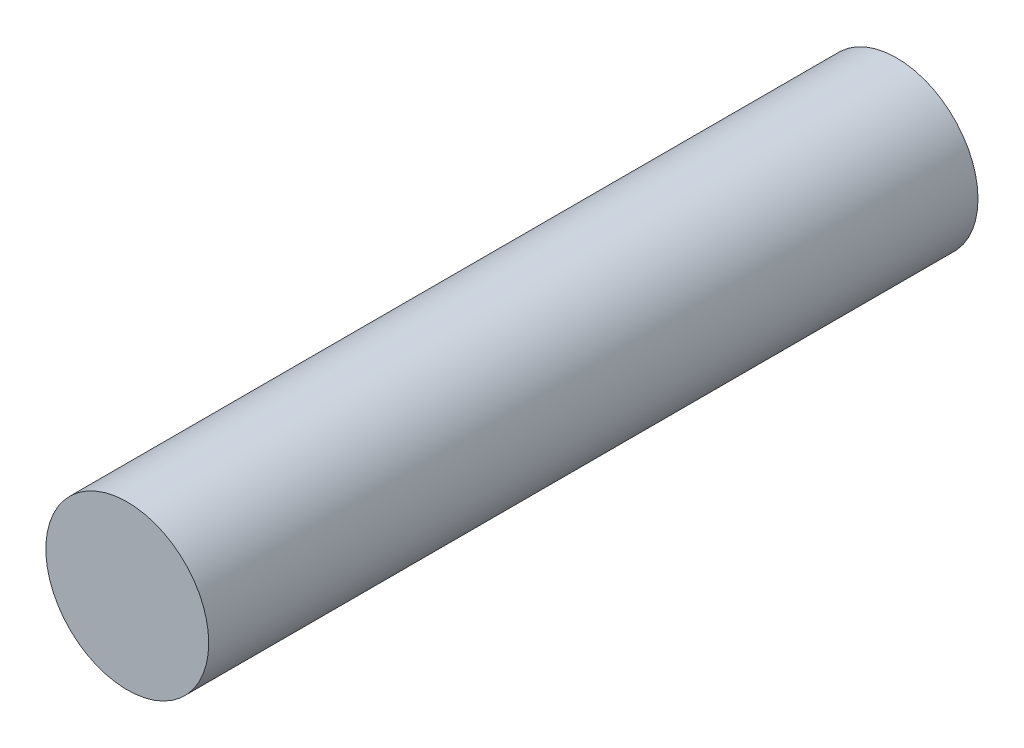
ISO-10303-21;
HEADER;
FILE_DESCRIPTION(('STEP AP214'),'2;1');
FILE_NAME('part.step','',(''),(''),'','','');
FILE_SCHEMA(('AUTOMOTIVE_DESIGN { 1 0 10303 214 1 1 1 1 }'));
ENDSEC;
DATA;
#1=APPLICATION_CONTEXT('core data for automotive mechanical design processes');
#2=APPLICATION_PROTOCOL_DEFINITION('international standard','automotive_design',2000,#1);
#3=PRODUCT_CONTEXT('',#1,'mechanical');
#4=PRODUCT('Part','Part','',(#3));
#5=PRODUCT_RELATED_PRODUCT_CATEGORY('part','',(#4));
#6=PRODUCT_DEFINITION_FORMATION('','',#4);
#7=PRODUCT_DEFINITION_CONTEXT('part definition',#1,'design');
#8=PRODUCT_DEFINITION('design','',#6,#7);
#9=PRODUCT_DEFINITION_SHAPE('','',#8);
#10=(LENGTH_UNIT() NAMED_UNIT(*) SI_UNIT(.MILLI.,.METRE.));
#11=(NAMED_UNIT(*) PLANE_ANGLE_UNIT() SI_UNIT($,.RADIAN.));
#12=(NAMED_UNIT(*) SI_UNIT($,.STERADIAN.) SOLID_ANGLE_UNIT());
#13=UNCERTAINTY_MEASURE_WITH_UNIT(LENGTH_MEASURE(1.E-05),#10,'distance_accuracy_value','');
#14=(GEOMETRIC_REPRESENTATION_CONTEXT(3) GLOBAL_UNCERTAINTY_ASSIGNED_CONTEXT((#13)) GLOBAL_UNIT_ASSIGNED_CONTEXT((#10,
#11,#12)) REPRESENTATION_CONTEXT('',''));
#15=CARTESIAN_POINT('',(0.,0.,0.));
#16=DIRECTION('',(0.,0.,1.));
#17=DIRECTION('',(1.,0.,0.));
#18=AXIS2_PLACEMENT_3D('',#15,#16,#17);
#19=CARTESIAN_POINT('',(0.,0.,37.5));
#20=DIRECTION('',(0.,0.,-1.));
#21=DIRECTION('',(-1.,0.,0.));
#22=AXIS2_PLACEMENT_3D('',#19,#20,#21);
#23=CYLINDRICAL_SURFACE('',#22,7.94);
#24=CARTESIAN_POINT('',(0.,0.,37.5));
#25=DIRECTION('',(0.,0.,1.));
#26=DIRECTION('',(1.,0.,0.));
#27=AXIS2_PLACEMENT_3D('',#24,#25,#26);
#28=CIRCLE('',#27,7.94);
#29=CARTESIAN_POINT('',(7.94,0.,37.5));
#30=VERTEX_POINT('',#29);
#31=EDGE_CURVE('E10',#30,#30,#28,.T.);
#32=ORIENTED_EDGE('',*,*,#31,.F.);
#33=EDGE_LOOP('',(#32));
#34=FACE_BOUND('',#33,.T.);
#35=CARTESIAN_POINT('',(0.,0.,-37.5));
#36=DIRECTION('',(0.,0.,1.));
#37=DIRECTION('',(1.,0.,0.));
#38=AXIS2_PLACEMENT_3D('',#35,#36,#37);
#39=CIRCLE('',#38,7.94);
#40=CARTESIAN_POINT('',(7.94,0.,-37.5));
#41=VERTEX_POINT('',#40);
#42=EDGE_CURVE('E34',#41,#41,#39,.T.);
#43=ORIENTED_EDGE('',*,*,#42,.T.);
#44=EDGE_LOOP('',(#43));
#45=FACE_BOUND('',#44,.T.);
#46=ADVANCED_FACE('F31',(#34,#45),#23,.T.);
#47=CARTESIAN_POINT('',(0.,0.,37.5));
#48=DIRECTION('',(0.,0.,1.));
#49=DIRECTION('',(1.,0.,0.));
#50=AXIS2_PLACEMENT_3D('',#47,#48,#49);
#51=PLANE('',#50);
#52=ORIENTED_EDGE('',*,*,#31,.T.);
#53=EDGE_LOOP('',(#52));
#54=FACE_BOUND('',#53,.T.);
#55=ADVANCED_FACE('F46',(#54),#51,.T.);
#56=CARTESIAN_POINT('',(0.,0.,-37.5));
#57=DIRECTION('',(0.,0.,1.));
#58=DIRECTION('',(1.,0.,0.));
#59=AXIS2_PLACEMENT_3D('',#56,#57,#58);
#60=PLANE('',#59);
#61=ORIENTED_EDGE('',*,*,#42,.F.);
#62=EDGE_LOOP('',(#61));
#63=FACE_BOUND('',#62,.T.);
#64=ADVANCED_FACE('F44',(#63),#60,.F.);
#65=CLOSED_SHELL('',(#46,#55,#64));
#66=MANIFOLD_SOLID_BREP('B2',#65);
#67=ADVANCED_BREP_SHAPE_REPRESENTATION('',(#18,#66),#14);
#68=SHAPE_DEFINITION_REPRESENTATION(#9,#67);
ENDSEC;
END-ISO-10303-21;
